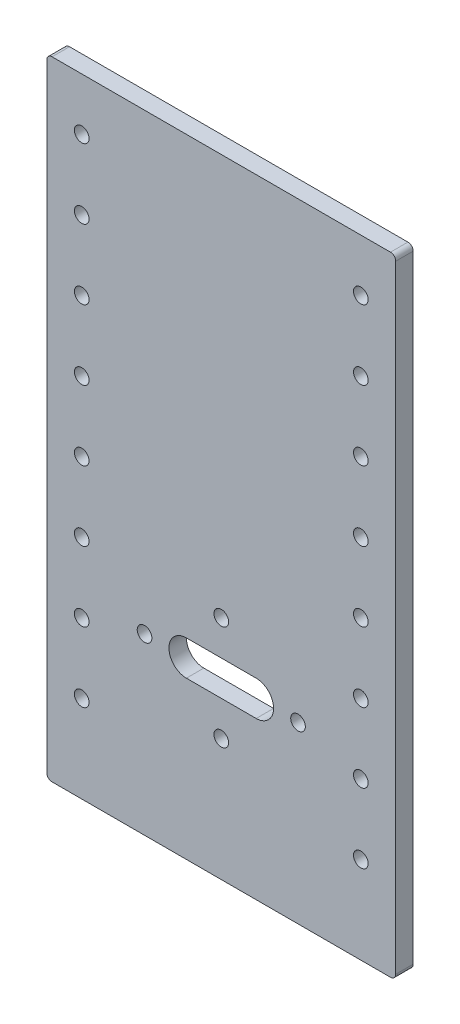
ISO-10303-21;
HEADER;
FILE_DESCRIPTION(('STEP AP214'),'2;1');
FILE_NAME('part.step','',(''),(''),'','','');
FILE_SCHEMA(('AUTOMOTIVE_DESIGN { 1 0 10303 214 1 1 1 1 }'));
ENDSEC;
DATA;
#1=APPLICATION_CONTEXT('core data for automotive mechanical design processes');
#2=APPLICATION_PROTOCOL_DEFINITION('international standard','automotive_design',2000,#1);
#3=PRODUCT_CONTEXT('',#1,'mechanical');
#4=PRODUCT('Part','Part','',(#3));
#5=PRODUCT_RELATED_PRODUCT_CATEGORY('part','',(#4));
#6=PRODUCT_DEFINITION_FORMATION('','',#4);
#7=PRODUCT_DEFINITION_CONTEXT('part definition',#1,'design');
#8=PRODUCT_DEFINITION('design','',#6,#7);
#9=PRODUCT_DEFINITION_SHAPE('','',#8);
#10=(LENGTH_UNIT() NAMED_UNIT(*) SI_UNIT(.MILLI.,.METRE.));
#11=(NAMED_UNIT(*) PLANE_ANGLE_UNIT() SI_UNIT($,.RADIAN.));
#12=(NAMED_UNIT(*) SI_UNIT($,.STERADIAN.) SOLID_ANGLE_UNIT());
#13=UNCERTAINTY_MEASURE_WITH_UNIT(LENGTH_MEASURE(1.E-05),#10,'distance_accuracy_value','');
#14=(GEOMETRIC_REPRESENTATION_CONTEXT(3) GLOBAL_UNCERTAINTY_ASSIGNED_CONTEXT((#13)) GLOBAL_UNIT_ASSIGNED_CONTEXT((#10,
#11,#12)) REPRESENTATION_CONTEXT('',''));
#15=CARTESIAN_POINT('',(0.,0.,0.));
#16=DIRECTION('',(0.,0.,1.));
#17=DIRECTION('',(1.,0.,0.));
#18=AXIS2_PLACEMENT_3D('',#15,#16,#17);
#19=CARTESIAN_POINT('',(50.,-90.,5.));
#20=DIRECTION('',(-1.,0.,0.));
#21=DIRECTION('',(0.,0.,1.));
#22=AXIS2_PLACEMENT_3D('',#19,#20,#21);
#23=PLANE('',#22);
#24=DIRECTION('',(0.,1.,0.));
#25=VECTOR('',#24,1.);
#26=CARTESIAN_POINT('',(50.,-90.,5.));
#27=LINE('',#26,#25);
#28=CARTESIAN_POINT('',(50.,-88.5,5.));
#29=VERTEX_POINT('',#28);
#30=CARTESIAN_POINT('',(50.,88.4999999999999,5.));
#31=VERTEX_POINT('',#30);
#32=EDGE_CURVE('E170',#29,#31,#27,.T.);
#33=ORIENTED_EDGE('',*,*,#32,.F.);
#34=DIRECTION('',(0.,0.,-1.));
#35=VECTOR('',#34,1.);
#36=CARTESIAN_POINT('',(50.,-88.5,5.));
#37=LINE('',#36,#35);
#38=CARTESIAN_POINT('',(50.,-88.5,0.));
#39=VERTEX_POINT('',#38);
#40=EDGE_CURVE('E192',#29,#39,#37,.T.);
#41=ORIENTED_EDGE('',*,*,#40,.T.);
#42=DIRECTION('',(0.,1.,0.));
#43=VECTOR('',#42,1.);
#44=CARTESIAN_POINT('',(50.,-90.,0.));
#45=LINE('',#44,#43);
#46=CARTESIAN_POINT('',(50.,88.4999999999999,0.));
#47=VERTEX_POINT('',#46);
#48=EDGE_CURVE('E166',#39,#47,#45,.T.);
#49=ORIENTED_EDGE('',*,*,#48,.T.);
#50=DIRECTION('',(0.,0.,-1.));
#51=VECTOR('',#50,1.);
#52=CARTESIAN_POINT('',(50.,88.5,5.));
#53=LINE('',#52,#51);
#54=EDGE_CURVE('E181',#47,#31,#53,.F.);
#55=ORIENTED_EDGE('',*,*,#54,.T.);
#56=EDGE_LOOP('',(#33,#41,#49,#55));
#57=FACE_BOUND('',#56,.T.);
#58=ADVANCED_FACE('F33',(#57),#23,.F.);
#59=CARTESIAN_POINT('',(-50.,90.,5.));
#60=DIRECTION('',(0.,-1.,0.));
#61=DIRECTION('',(0.,0.,-1.));
#62=AXIS2_PLACEMENT_3D('',#59,#60,#61);
#63=PLANE('',#62);
#64=DIRECTION('',(-1.,0.,0.));
#65=VECTOR('',#64,1.);
#66=CARTESIAN_POINT('',(-50.,90.,0.));
#67=LINE('',#66,#65);
#68=CARTESIAN_POINT('',(48.5,90.,0.));
#69=VERTEX_POINT('',#68);
#70=CARTESIAN_POINT('',(-48.5,90.,0.));
#71=VERTEX_POINT('',#70);
#72=EDGE_CURVE('E184',#69,#71,#67,.T.);
#73=ORIENTED_EDGE('',*,*,#72,.T.);
#74=DIRECTION('',(0.,0.,-1.));
#75=VECTOR('',#74,1.);
#76=CARTESIAN_POINT('',(-48.5,90.,5.));
#77=LINE('',#76,#75);
#78=CARTESIAN_POINT('',(-48.5,90.,5.));
#79=VERTEX_POINT('',#78);
#80=EDGE_CURVE('E11',#71,#79,#77,.F.);
#81=ORIENTED_EDGE('',*,*,#80,.T.);
#82=DIRECTION('',(-1.,0.,0.));
#83=VECTOR('',#82,1.);
#84=CARTESIAN_POINT('',(-50.,90.,5.));
#85=LINE('',#84,#83);
#86=CARTESIAN_POINT('',(48.5,90.,5.));
#87=VERTEX_POINT('',#86);
#88=EDGE_CURVE('E173',#87,#79,#85,.T.);
#89=ORIENTED_EDGE('',*,*,#88,.F.);
#90=DIRECTION('',(0.,0.,-1.));
#91=VECTOR('',#90,1.);
#92=CARTESIAN_POINT('',(48.5,90.,5.));
#93=LINE('',#92,#91);
#94=EDGE_CURVE('E41',#87,#69,#93,.T.);
#95=ORIENTED_EDGE('',*,*,#94,.T.);
#96=EDGE_LOOP('',(#73,#81,#89,#95));
#97=FACE_BOUND('',#96,.T.);
#98=ADVANCED_FACE('F223',(#97),#63,.F.);
#99=CARTESIAN_POINT('',(-50.,-90.,5.));
#100=DIRECTION('',(1.,0.,0.));
#101=DIRECTION('',(0.,0.,-1.));
#102=AXIS2_PLACEMENT_3D('',#99,#100,#101);
#103=PLANE('',#102);
#104=DIRECTION('',(0.,-1.,0.));
#105=VECTOR('',#104,1.);
#106=CARTESIAN_POINT('',(-50.,-90.,0.));
#107=LINE('',#106,#105);
#108=CARTESIAN_POINT('',(-50.,88.4999999999999,0.));
#109=VERTEX_POINT('',#108);
#110=CARTESIAN_POINT('',(-50.,-88.5,0.));
#111=VERTEX_POINT('',#110);
#112=EDGE_CURVE('E187',#109,#111,#107,.T.);
#113=ORIENTED_EDGE('',*,*,#112,.T.);
#114=DIRECTION('',(0.,0.,-1.));
#115=VECTOR('',#114,1.);
#116=CARTESIAN_POINT('',(-50.,-88.5,5.));
#117=LINE('',#116,#115);
#118=CARTESIAN_POINT('',(-50.,-88.5,5.));
#119=VERTEX_POINT('',#118);
#120=EDGE_CURVE('E48',#111,#119,#117,.F.);
#121=ORIENTED_EDGE('',*,*,#120,.T.);
#122=DIRECTION('',(0.,-1.,0.));
#123=VECTOR('',#122,1.);
#124=CARTESIAN_POINT('',(-50.,-90.,5.));
#125=LINE('',#124,#123);
#126=CARTESIAN_POINT('',(-50.,88.4999999999999,5.));
#127=VERTEX_POINT('',#126);
#128=EDGE_CURVE('E176',#127,#119,#125,.T.);
#129=ORIENTED_EDGE('',*,*,#128,.F.);
#130=DIRECTION('',(0.,0.,-1.));
#131=VECTOR('',#130,1.);
#132=CARTESIAN_POINT('',(-50.,88.5,5.));
#133=LINE('',#132,#131);
#134=EDGE_CURVE('E215',#127,#109,#133,.T.);
#135=ORIENTED_EDGE('',*,*,#134,.T.);
#136=EDGE_LOOP('',(#113,#121,#129,#135));
#137=FACE_BOUND('',#136,.T.);
#138=ADVANCED_FACE('F234',(#137),#103,.F.);
#139=CARTESIAN_POINT('',(-50.,-90.,5.));
#140=DIRECTION('',(0.,1.,0.));
#141=DIRECTION('',(0.,0.,1.));
#142=AXIS2_PLACEMENT_3D('',#139,#140,#141);
#143=PLANE('',#142);
#144=DIRECTION('',(1.,0.,0.));
#145=VECTOR('',#144,1.);
#146=CARTESIAN_POINT('',(-50.,-90.,0.));
#147=LINE('',#146,#145);
#148=CARTESIAN_POINT('',(-48.5,-90.,0.));
#149=VERTEX_POINT('',#148);
#150=CARTESIAN_POINT('',(48.5,-90.,0.));
#151=VERTEX_POINT('',#150);
#152=EDGE_CURVE('E174',#149,#151,#147,.T.);
#153=ORIENTED_EDGE('',*,*,#152,.T.);
#154=DIRECTION('',(0.,0.,-1.));
#155=VECTOR('',#154,1.);
#156=CARTESIAN_POINT('',(48.5,-90.,5.));
#157=LINE('',#156,#155);
#158=CARTESIAN_POINT('',(48.5,-90.,5.));
#159=VERTEX_POINT('',#158);
#160=EDGE_CURVE('E206',#151,#159,#157,.F.);
#161=ORIENTED_EDGE('',*,*,#160,.T.);
#162=DIRECTION('',(1.,0.,0.));
#163=VECTOR('',#162,1.);
#164=CARTESIAN_POINT('',(-50.,-90.,5.));
#165=LINE('',#164,#163);
#166=CARTESIAN_POINT('',(-48.5,-90.,5.));
#167=VERTEX_POINT('',#166);
#168=EDGE_CURVE('E178',#167,#159,#165,.T.);
#169=ORIENTED_EDGE('',*,*,#168,.F.);
#170=DIRECTION('',(0.,0.,-1.));
#171=VECTOR('',#170,1.);
#172=CARTESIAN_POINT('',(-48.5,-90.,5.));
#173=LINE('',#172,#171);
#174=EDGE_CURVE('E203',#167,#149,#173,.T.);
#175=ORIENTED_EDGE('',*,*,#174,.T.);
#176=EDGE_LOOP('',(#153,#161,#169,#175));
#177=FACE_BOUND('',#176,.T.);
#178=ADVANCED_FACE('F242',(#177),#143,.F.);
#179=CARTESIAN_POINT('',(0.,0.,5.));
#180=DIRECTION('',(0.,0.,-1.));
#181=DIRECTION('',(-1.,0.,0.));
#182=AXIS2_PLACEMENT_3D('',#179,#180,#181);
#183=PLANE('',#182);
#184=CARTESIAN_POINT('',(40.,55.,5.));
#185=DIRECTION('',(0.,0.,-1.));
#186=DIRECTION('',(-1.,0.,0.));
#187=AXIS2_PLACEMENT_3D('',#184,#185,#186);
#188=CIRCLE('',#187,2.1);
#189=CARTESIAN_POINT('',(37.9,55.,5.));
#190=VERTEX_POINT('',#189);
#191=EDGE_CURVE('E620',#190,#190,#188,.T.);
#192=ORIENTED_EDGE('',*,*,#191,.T.);
#193=EDGE_LOOP('',(#192));
#194=FACE_BOUND('',#193,.T.);
#195=CARTESIAN_POINT('',(40.,35.,5.));
#196=DIRECTION('',(0.,0.,-1.));
#197=DIRECTION('',(-1.,0.,0.));
#198=AXIS2_PLACEMENT_3D('',#195,#196,#197);
#199=CIRCLE('',#198,2.1);
#200=CARTESIAN_POINT('',(37.9,35.,5.));
#201=VERTEX_POINT('',#200);
#202=EDGE_CURVE('E662',#201,#201,#199,.T.);
#203=ORIENTED_EDGE('',*,*,#202,.T.);
#204=EDGE_LOOP('',(#203));
#205=FACE_BOUND('',#204,.T.);
#206=CARTESIAN_POINT('',(40.,15.,5.));
#207=DIRECTION('',(0.,0.,-1.));
#208=DIRECTION('',(-1.,0.,0.));
#209=AXIS2_PLACEMENT_3D('',#206,#207,#208);
#210=CIRCLE('',#209,2.1);
#211=CARTESIAN_POINT('',(37.9,15.,5.));
#212=VERTEX_POINT('',#211);
#213=EDGE_CURVE('E656',#212,#212,#210,.T.);
#214=ORIENTED_EDGE('',*,*,#213,.T.);
#215=EDGE_LOOP('',(#214));
#216=FACE_BOUND('',#215,.T.);
#217=CARTESIAN_POINT('',(40.,-4.99999999999999,5.));
#218=DIRECTION('',(0.,0.,-1.));
#219=DIRECTION('',(-1.,0.,0.));
#220=AXIS2_PLACEMENT_3D('',#217,#218,#219);
#221=CIRCLE('',#220,2.1);
#222=CARTESIAN_POINT('',(37.9,-4.99999999999999,5.));
#223=VERTEX_POINT('',#222);
#224=EDGE_CURVE('E650',#223,#223,#221,.T.);
#225=ORIENTED_EDGE('',*,*,#224,.T.);
#226=EDGE_LOOP('',(#225));
#227=FACE_BOUND('',#226,.T.);
#228=CARTESIAN_POINT('',(-40.,-4.99999999999998,5.));
#229=DIRECTION('',(0.,0.,-1.));
#230=DIRECTION('',(1.,0.,0.));
#231=AXIS2_PLACEMENT_3D('',#228,#229,#230);
#232=CIRCLE('',#231,2.1);
#233=CARTESIAN_POINT('',(-37.9,-4.99999999999998,5.));
#234=VERTEX_POINT('',#233);
#235=EDGE_CURVE('E644',#234,#234,#232,.T.);
#236=ORIENTED_EDGE('',*,*,#235,.T.);
#237=EDGE_LOOP('',(#236));
#238=FACE_BOUND('',#237,.T.);
#239=CARTESIAN_POINT('',(-40.,15.,5.));
#240=DIRECTION('',(0.,0.,-1.));
#241=DIRECTION('',(1.,0.,0.));
#242=AXIS2_PLACEMENT_3D('',#239,#240,#241);
#243=CIRCLE('',#242,2.1);
#244=CARTESIAN_POINT('',(-37.9,15.,5.));
#245=VERTEX_POINT('',#244);
#246=EDGE_CURVE('E638',#245,#245,#243,.T.);
#247=ORIENTED_EDGE('',*,*,#246,.T.);
#248=EDGE_LOOP('',(#247));
#249=FACE_BOUND('',#248,.T.);
#250=CARTESIAN_POINT('',(-40.,35.,5.));
#251=DIRECTION('',(0.,0.,-1.));
#252=DIRECTION('',(1.,0.,0.));
#253=AXIS2_PLACEMENT_3D('',#250,#251,#252);
#254=CIRCLE('',#253,2.1);
#255=CARTESIAN_POINT('',(-37.9,35.,5.));
#256=VERTEX_POINT('',#255);
#257=EDGE_CURVE('E632',#256,#256,#254,.T.);
#258=ORIENTED_EDGE('',*,*,#257,.T.);
#259=EDGE_LOOP('',(#258));
#260=FACE_BOUND('',#259,.T.);
#261=CARTESIAN_POINT('',(-40.,75.,5.));
#262=DIRECTION('',(0.,0.,-1.));
#263=DIRECTION('',(1.,0.,0.));
#264=AXIS2_PLACEMENT_3D('',#261,#262,#263);
#265=CIRCLE('',#264,2.1);
#266=CARTESIAN_POINT('',(-37.9,75.,5.));
#267=VERTEX_POINT('',#266);
#268=EDGE_CURVE('E625',#267,#267,#265,.T.);
#269=ORIENTED_EDGE('',*,*,#268,.T.);
#270=EDGE_LOOP('',(#269));
#271=FACE_BOUND('',#270,.T.);
#272=CARTESIAN_POINT('',(-40.,-25.,5.));
#273=DIRECTION('',(0.,0.,-1.));
#274=DIRECTION('',(1.,0.,0.));
#275=AXIS2_PLACEMENT_3D('',#272,#273,#274);
#276=CIRCLE('',#275,2.1);
#277=CARTESIAN_POINT('',(-37.9,-25.,5.));
#278=VERTEX_POINT('',#277);
#279=EDGE_CURVE('E697',#278,#278,#276,.T.);
#280=ORIENTED_EDGE('',*,*,#279,.T.);
#281=EDGE_LOOP('',(#280));
#282=FACE_BOUND('',#281,.T.);
#283=CARTESIAN_POINT('',(-40.,-45.,5.));
#284=DIRECTION('',(0.,0.,-1.));
#285=DIRECTION('',(1.,0.,0.));
#286=AXIS2_PLACEMENT_3D('',#283,#284,#285);
#287=CIRCLE('',#286,2.1);
#288=CARTESIAN_POINT('',(-37.9,-45.,5.));
#289=VERTEX_POINT('',#288);
#290=EDGE_CURVE('E703',#289,#289,#287,.T.);
#291=ORIENTED_EDGE('',*,*,#290,.T.);
#292=EDGE_LOOP('',(#291));
#293=FACE_BOUND('',#292,.T.);
#294=CARTESIAN_POINT('',(-40.,-65.,5.));
#295=DIRECTION('',(0.,0.,-1.));
#296=DIRECTION('',(1.,0.,0.));
#297=AXIS2_PLACEMENT_3D('',#294,#295,#296);
#298=CIRCLE('',#297,2.1);
#299=CARTESIAN_POINT('',(-37.9,-65.,5.));
#300=VERTEX_POINT('',#299);
#301=EDGE_CURVE('E674',#300,#300,#298,.T.);
#302=ORIENTED_EDGE('',*,*,#301,.T.);
#303=EDGE_LOOP('',(#302));
#304=FACE_BOUND('',#303,.T.);
#305=CARTESIAN_POINT('',(40.,-65.,5.));
#306=DIRECTION('',(0.,0.,-1.));
#307=DIRECTION('',(-1.,0.,0.));
#308=AXIS2_PLACEMENT_3D('',#305,#306,#307);
#309=CIRCLE('',#308,2.1);
#310=CARTESIAN_POINT('',(37.9,-65.,5.));
#311=VERTEX_POINT('',#310);
#312=EDGE_CURVE('E673',#311,#311,#309,.T.);
#313=ORIENTED_EDGE('',*,*,#312,.T.);
#314=EDGE_LOOP('',(#313));
#315=FACE_BOUND('',#314,.T.);
#316=CARTESIAN_POINT('',(40.,-45.,5.));
#317=DIRECTION('',(0.,0.,-1.));
#318=DIRECTION('',(-1.,0.,0.));
#319=AXIS2_PLACEMENT_3D('',#316,#317,#318);
#320=CIRCLE('',#319,2.1);
#321=CARTESIAN_POINT('',(37.9,-45.,5.));
#322=VERTEX_POINT('',#321);
#323=EDGE_CURVE('E680',#322,#322,#320,.T.);
#324=ORIENTED_EDGE('',*,*,#323,.T.);
#325=EDGE_LOOP('',(#324));
#326=FACE_BOUND('',#325,.T.);
#327=CARTESIAN_POINT('',(40.,-25.,5.));
#328=DIRECTION('',(0.,0.,-1.));
#329=DIRECTION('',(-1.,0.,0.));
#330=AXIS2_PLACEMENT_3D('',#327,#328,#329);
#331=CIRCLE('',#330,2.1);
#332=CARTESIAN_POINT('',(37.9,-25.,5.));
#333=VERTEX_POINT('',#332);
#334=EDGE_CURVE('E686',#333,#333,#331,.T.);
#335=ORIENTED_EDGE('',*,*,#334,.T.);
#336=EDGE_LOOP('',(#335));
#337=FACE_BOUND('',#336,.T.);
#338=CARTESIAN_POINT('',(-40.,55.,5.));
#339=DIRECTION('',(0.,0.,-1.));
#340=DIRECTION('',(1.,0.,0.));
#341=AXIS2_PLACEMENT_3D('',#338,#339,#340);
#342=CIRCLE('',#341,2.1);
#343=CARTESIAN_POINT('',(-37.9,55.,5.));
#344=VERTEX_POINT('',#343);
#345=EDGE_CURVE('E626',#344,#344,#342,.T.);
#346=ORIENTED_EDGE('',*,*,#345,.T.);
#347=EDGE_LOOP('',(#346));
#348=FACE_BOUND('',#347,.T.);
#349=CARTESIAN_POINT('',(40.,75.,5.));
#350=DIRECTION('',(0.,0.,-1.));
#351=DIRECTION('',(-1.,0.,0.));
#352=AXIS2_PLACEMENT_3D('',#349,#350,#351);
#353=CIRCLE('',#352,2.1);
#354=CARTESIAN_POINT('',(37.9,75.,5.));
#355=VERTEX_POINT('',#354);
#356=EDGE_CURVE('E598',#355,#355,#353,.T.);
#357=ORIENTED_EDGE('',*,*,#356,.T.);
#358=EDGE_LOOP('',(#357));
#359=FACE_BOUND('',#358,.T.);
#360=CARTESIAN_POINT('',(22.,-40.,5.));
#361=DIRECTION('',(0.,0.,-1.));
#362=DIRECTION('',(-1.,0.,0.));
#363=AXIS2_PLACEMENT_3D('',#360,#361,#362);
#364=CIRCLE('',#363,2.1);
#365=CARTESIAN_POINT('',(19.9,-40.,5.));
#366=VERTEX_POINT('',#365);
#367=EDGE_CURVE('E160',#366,#366,#364,.T.);
#368=ORIENTED_EDGE('',*,*,#367,.T.);
#369=EDGE_LOOP('',(#368));
#370=FACE_BOUND('',#369,.T.);
#371=CARTESIAN_POINT('',(0.,-25.,5.));
#372=DIRECTION('',(0.,0.,-1.));
#373=DIRECTION('',(-1.,0.,0.));
#374=AXIS2_PLACEMENT_3D('',#371,#372,#373);
#375=CIRCLE('',#374,2.1);
#376=CARTESIAN_POINT('',(-2.1,-25.,5.));
#377=VERTEX_POINT('',#376);
#378=EDGE_CURVE('E575',#377,#377,#375,.T.);
#379=ORIENTED_EDGE('',*,*,#378,.T.);
#380=EDGE_LOOP('',(#379));
#381=FACE_BOUND('',#380,.T.);
#382=CARTESIAN_POINT('',(-22.,-40.,5.));
#383=DIRECTION('',(0.,0.,-1.));
#384=DIRECTION('',(1.,0.,0.));
#385=AXIS2_PLACEMENT_3D('',#382,#383,#384);
#386=CIRCLE('',#385,2.1);
#387=CARTESIAN_POINT('',(-19.9,-40.,5.));
#388=VERTEX_POINT('',#387);
#389=EDGE_CURVE('E579',#388,#388,#386,.T.);
#390=ORIENTED_EDGE('',*,*,#389,.T.);
#391=EDGE_LOOP('',(#390));
#392=FACE_BOUND('',#391,.T.);
#393=CARTESIAN_POINT('',(0.,-55.,5.));
#394=DIRECTION('',(0.,0.,-1.));
#395=DIRECTION('',(1.,0.,0.));
#396=AXIS2_PLACEMENT_3D('',#393,#394,#395);
#397=CIRCLE('',#396,2.1);
#398=CARTESIAN_POINT('',(2.1,-55.,5.));
#399=VERTEX_POINT('',#398);
#400=EDGE_CURVE('E587',#399,#399,#397,.T.);
#401=ORIENTED_EDGE('',*,*,#400,.T.);
#402=EDGE_LOOP('',(#401));
#403=FACE_BOUND('',#402,.T.);
#404=DIRECTION('',(1.,0.,0.));
#405=VECTOR('',#404,1.);
#406=CARTESIAN_POINT('',(10.,-35.,5.));
#407=LINE('',#406,#405);
#408=CARTESIAN_POINT('',(-9.99999999999999,-35.,5.));
#409=VERTEX_POINT('',#408);
#410=CARTESIAN_POINT('',(10.,-35.,5.));
#411=VERTEX_POINT('',#410);
#412=EDGE_CURVE('E135',#409,#411,#407,.T.);
#413=ORIENTED_EDGE('',*,*,#412,.T.);
#414=CARTESIAN_POINT('',(10.,-40.,5.));
#415=DIRECTION('',(0.,0.,-1.));
#416=DIRECTION('',(-1.,0.,0.));
#417=AXIS2_PLACEMENT_3D('',#414,#415,#416);
#418=CIRCLE('',#417,5.00000000000002);
#419=CARTESIAN_POINT('',(10.,-45.,5.));
#420=VERTEX_POINT('',#419);
#421=EDGE_CURVE('E127',#411,#420,#418,.T.);
#422=ORIENTED_EDGE('',*,*,#421,.T.);
#423=DIRECTION('',(-1.,0.,0.));
#424=VECTOR('',#423,1.);
#425=CARTESIAN_POINT('',(10.,-45.,5.));
#426=LINE('',#425,#424);
#427=CARTESIAN_POINT('',(-9.99999999999999,-45.,5.));
#428=VERTEX_POINT('',#427);
#429=EDGE_CURVE('E139',#420,#428,#426,.T.);
#430=ORIENTED_EDGE('',*,*,#429,.T.);
#431=CARTESIAN_POINT('',(-9.99999999999999,-40.,5.));
#432=DIRECTION('',(0.,0.,-1.));
#433=DIRECTION('',(-1.,0.,0.));
#434=AXIS2_PLACEMENT_3D('',#431,#432,#433);
#435=CIRCLE('',#434,5.00000000000002);
#436=EDGE_CURVE('E143',#428,#409,#435,.T.);
#437=ORIENTED_EDGE('',*,*,#436,.T.);
#438=EDGE_LOOP('',(#413,#422,#430,#437));
#439=FACE_BOUND('',#438,.T.);
#440=ORIENTED_EDGE('',*,*,#168,.T.);
#441=CARTESIAN_POINT('',(48.5,-88.5,5.));
#442=DIRECTION('',(0.,0.,-1.));
#443=DIRECTION('',(-1.,0.,0.));
#444=AXIS2_PLACEMENT_3D('',#441,#442,#443);
#445=CIRCLE('',#444,1.5);
#446=EDGE_CURVE('E213',#159,#29,#445,.F.);
#447=ORIENTED_EDGE('',*,*,#446,.T.);
#448=ORIENTED_EDGE('',*,*,#32,.T.);
#449=CARTESIAN_POINT('',(48.5,88.5,5.));
#450=DIRECTION('',(0.,0.,-1.));
#451=DIRECTION('',(-1.,0.,0.));
#452=AXIS2_PLACEMENT_3D('',#449,#450,#451);
#453=CIRCLE('',#452,1.5);
#454=EDGE_CURVE('E208',#31,#87,#453,.F.);
#455=ORIENTED_EDGE('',*,*,#454,.T.);
#456=ORIENTED_EDGE('',*,*,#88,.T.);
#457=CARTESIAN_POINT('',(-48.5,88.5,5.));
#458=DIRECTION('',(0.,0.,-1.));
#459=DIRECTION('',(-1.,0.,0.));
#460=AXIS2_PLACEMENT_3D('',#457,#458,#459);
#461=CIRCLE('',#460,1.5);
#462=EDGE_CURVE('E55',#79,#127,#461,.F.);
#463=ORIENTED_EDGE('',*,*,#462,.T.);
#464=ORIENTED_EDGE('',*,*,#128,.T.);
#465=CARTESIAN_POINT('',(-48.5,-88.5,5.));
#466=DIRECTION('',(0.,0.,-1.));
#467=DIRECTION('',(-1.,0.,0.));
#468=AXIS2_PLACEMENT_3D('',#465,#466,#467);
#469=CIRCLE('',#468,1.5);
#470=EDGE_CURVE('E211',#119,#167,#469,.F.);
#471=ORIENTED_EDGE('',*,*,#470,.T.);
#472=EDGE_LOOP('',(#440,#447,#448,#455,#456,#463,#464,#471));
#473=FACE_BOUND('',#472,.T.);
#474=ADVANCED_FACE('F145',(#194,#205,#216,#227,#238,#249,#260,#271,#282,#293,#304,#315,#326,
#337,#348,#359,#370,#381,#392,#403,#439,#473),#183,.F.);
#475=CARTESIAN_POINT('',(0.,0.,0.));
#476=DIRECTION('',(0.,0.,-1.));
#477=DIRECTION('',(-1.,0.,0.));
#478=AXIS2_PLACEMENT_3D('',#475,#476,#477);
#479=PLANE('',#478);
#480=CARTESIAN_POINT('',(40.,55.,0.));
#481=DIRECTION('',(0.,0.,-1.));
#482=DIRECTION('',(-1.,0.,0.));
#483=AXIS2_PLACEMENT_3D('',#480,#481,#482);
#484=CIRCLE('',#483,2.1);
#485=CARTESIAN_POINT('',(37.9,55.,0.));
#486=VERTEX_POINT('',#485);
#487=EDGE_CURVE('E665',#486,#486,#484,.T.);
#488=ORIENTED_EDGE('',*,*,#487,.F.);
#489=EDGE_LOOP('',(#488));
#490=FACE_BOUND('',#489,.T.);
#491=CARTESIAN_POINT('',(40.,35.,0.));
#492=DIRECTION('',(0.,0.,-1.));
#493=DIRECTION('',(-1.,0.,0.));
#494=AXIS2_PLACEMENT_3D('',#491,#492,#493);
#495=CIRCLE('',#494,2.1);
#496=CARTESIAN_POINT('',(37.9,35.,0.));
#497=VERTEX_POINT('',#496);
#498=EDGE_CURVE('E659',#497,#497,#495,.T.);
#499=ORIENTED_EDGE('',*,*,#498,.F.);
#500=EDGE_LOOP('',(#499));
#501=FACE_BOUND('',#500,.T.);
#502=CARTESIAN_POINT('',(40.,15.,0.));
#503=DIRECTION('',(0.,0.,-1.));
#504=DIRECTION('',(-1.,0.,0.));
#505=AXIS2_PLACEMENT_3D('',#502,#503,#504);
#506=CIRCLE('',#505,2.1);
#507=CARTESIAN_POINT('',(37.9,15.,0.));
#508=VERTEX_POINT('',#507);
#509=EDGE_CURVE('E653',#508,#508,#506,.T.);
#510=ORIENTED_EDGE('',*,*,#509,.F.);
#511=EDGE_LOOP('',(#510));
#512=FACE_BOUND('',#511,.T.);
#513=CARTESIAN_POINT('',(40.,-4.99999999999999,0.));
#514=DIRECTION('',(0.,0.,-1.));
#515=DIRECTION('',(-1.,0.,0.));
#516=AXIS2_PLACEMENT_3D('',#513,#514,#515);
#517=CIRCLE('',#516,2.1);
#518=CARTESIAN_POINT('',(37.9,-4.99999999999999,0.));
#519=VERTEX_POINT('',#518);
#520=EDGE_CURVE('E647',#519,#519,#517,.T.);
#521=ORIENTED_EDGE('',*,*,#520,.F.);
#522=EDGE_LOOP('',(#521));
#523=FACE_BOUND('',#522,.T.);
#524=CARTESIAN_POINT('',(-40.,-4.99999999999998,0.));
#525=DIRECTION('',(0.,0.,-1.));
#526=DIRECTION('',(1.,0.,0.));
#527=AXIS2_PLACEMENT_3D('',#524,#525,#526);
#528=CIRCLE('',#527,2.1);
#529=CARTESIAN_POINT('',(-37.9,-4.99999999999998,0.));
#530=VERTEX_POINT('',#529);
#531=EDGE_CURVE('E641',#530,#530,#528,.T.);
#532=ORIENTED_EDGE('',*,*,#531,.F.);
#533=EDGE_LOOP('',(#532));
#534=FACE_BOUND('',#533,.T.);
#535=CARTESIAN_POINT('',(-40.,15.,0.));
#536=DIRECTION('',(0.,0.,-1.));
#537=DIRECTION('',(1.,0.,0.));
#538=AXIS2_PLACEMENT_3D('',#535,#536,#537);
#539=CIRCLE('',#538,2.1);
#540=CARTESIAN_POINT('',(-37.9,15.,0.));
#541=VERTEX_POINT('',#540);
#542=EDGE_CURVE('E635',#541,#541,#539,.T.);
#543=ORIENTED_EDGE('',*,*,#542,.F.);
#544=EDGE_LOOP('',(#543));
#545=FACE_BOUND('',#544,.T.);
#546=CARTESIAN_POINT('',(-40.,35.,0.));
#547=DIRECTION('',(0.,0.,-1.));
#548=DIRECTION('',(1.,0.,0.));
#549=AXIS2_PLACEMENT_3D('',#546,#547,#548);
#550=CIRCLE('',#549,2.1);
#551=CARTESIAN_POINT('',(-37.9,35.,0.));
#552=VERTEX_POINT('',#551);
#553=EDGE_CURVE('E629',#552,#552,#550,.T.);
#554=ORIENTED_EDGE('',*,*,#553,.F.);
#555=EDGE_LOOP('',(#554));
#556=FACE_BOUND('',#555,.T.);
#557=CARTESIAN_POINT('',(-40.,75.,0.));
#558=DIRECTION('',(0.,0.,-1.));
#559=DIRECTION('',(1.,0.,0.));
#560=AXIS2_PLACEMENT_3D('',#557,#558,#559);
#561=CIRCLE('',#560,2.1);
#562=CARTESIAN_POINT('',(-37.9,75.,0.));
#563=VERTEX_POINT('',#562);
#564=EDGE_CURVE('E622',#563,#563,#561,.T.);
#565=ORIENTED_EDGE('',*,*,#564,.F.);
#566=EDGE_LOOP('',(#565));
#567=FACE_BOUND('',#566,.T.);
#568=CARTESIAN_POINT('',(-40.,-25.,0.));
#569=DIRECTION('',(0.,0.,-1.));
#570=DIRECTION('',(1.,0.,0.));
#571=AXIS2_PLACEMENT_3D('',#568,#569,#570);
#572=CIRCLE('',#571,2.1);
#573=CARTESIAN_POINT('',(-37.9,-25.,0.));
#574=VERTEX_POINT('',#573);
#575=EDGE_CURVE('E694',#574,#574,#572,.T.);
#576=ORIENTED_EDGE('',*,*,#575,.F.);
#577=EDGE_LOOP('',(#576));
#578=FACE_BOUND('',#577,.T.);
#579=CARTESIAN_POINT('',(-40.,-45.,0.));
#580=DIRECTION('',(0.,0.,-1.));
#581=DIRECTION('',(1.,0.,0.));
#582=AXIS2_PLACEMENT_3D('',#579,#580,#581);
#583=CIRCLE('',#582,2.1);
#584=CARTESIAN_POINT('',(-37.9,-45.,0.));
#585=VERTEX_POINT('',#584);
#586=EDGE_CURVE('E700',#585,#585,#583,.T.);
#587=ORIENTED_EDGE('',*,*,#586,.F.);
#588=EDGE_LOOP('',(#587));
#589=FACE_BOUND('',#588,.T.);
#590=CARTESIAN_POINT('',(-40.,-65.,0.));
#591=DIRECTION('',(0.,0.,-1.));
#592=DIRECTION('',(1.,0.,0.));
#593=AXIS2_PLACEMENT_3D('',#590,#591,#592);
#594=CIRCLE('',#593,2.1);
#595=CARTESIAN_POINT('',(-37.9,-65.,0.));
#596=VERTEX_POINT('',#595);
#597=EDGE_CURVE('E706',#596,#596,#594,.T.);
#598=ORIENTED_EDGE('',*,*,#597,.F.);
#599=EDGE_LOOP('',(#598));
#600=FACE_BOUND('',#599,.T.);
#601=CARTESIAN_POINT('',(40.,-65.,0.));
#602=DIRECTION('',(0.,0.,-1.));
#603=DIRECTION('',(-1.,0.,0.));
#604=AXIS2_PLACEMENT_3D('',#601,#602,#603);
#605=CIRCLE('',#604,2.1);
#606=CARTESIAN_POINT('',(37.9,-65.,0.));
#607=VERTEX_POINT('',#606);
#608=EDGE_CURVE('E670',#607,#607,#605,.T.);
#609=ORIENTED_EDGE('',*,*,#608,.F.);
#610=EDGE_LOOP('',(#609));
#611=FACE_BOUND('',#610,.T.);
#612=CARTESIAN_POINT('',(40.,-45.,0.));
#613=DIRECTION('',(0.,0.,-1.));
#614=DIRECTION('',(-1.,0.,0.));
#615=AXIS2_PLACEMENT_3D('',#612,#613,#614);
#616=CIRCLE('',#615,2.1);
#617=CARTESIAN_POINT('',(37.9,-45.,0.));
#618=VERTEX_POINT('',#617);
#619=EDGE_CURVE('E677',#618,#618,#616,.T.);
#620=ORIENTED_EDGE('',*,*,#619,.F.);
#621=EDGE_LOOP('',(#620));
#622=FACE_BOUND('',#621,.T.);
#623=CARTESIAN_POINT('',(40.,-25.,0.));
#624=DIRECTION('',(0.,0.,-1.));
#625=DIRECTION('',(-1.,0.,0.));
#626=AXIS2_PLACEMENT_3D('',#623,#624,#625);
#627=CIRCLE('',#626,2.1);
#628=CARTESIAN_POINT('',(37.9,-25.,0.));
#629=VERTEX_POINT('',#628);
#630=EDGE_CURVE('E683',#629,#629,#627,.T.);
#631=ORIENTED_EDGE('',*,*,#630,.F.);
#632=EDGE_LOOP('',(#631));
#633=FACE_BOUND('',#632,.T.);
#634=CARTESIAN_POINT('',(-40.,55.,0.));
#635=DIRECTION('',(0.,0.,-1.));
#636=DIRECTION('',(1.,0.,0.));
#637=AXIS2_PLACEMENT_3D('',#634,#635,#636);
#638=CIRCLE('',#637,2.1);
#639=CARTESIAN_POINT('',(-37.9,55.,0.));
#640=VERTEX_POINT('',#639);
#641=EDGE_CURVE('E689',#640,#640,#638,.T.);
#642=ORIENTED_EDGE('',*,*,#641,.F.);
#643=EDGE_LOOP('',(#642));
#644=FACE_BOUND('',#643,.T.);
#645=CARTESIAN_POINT('',(40.,75.,0.));
#646=DIRECTION('',(0.,0.,-1.));
#647=DIRECTION('',(-1.,0.,0.));
#648=AXIS2_PLACEMENT_3D('',#645,#646,#647);
#649=CIRCLE('',#648,2.1);
#650=CARTESIAN_POINT('',(37.9,75.,0.));
#651=VERTEX_POINT('',#650);
#652=EDGE_CURVE('E590',#651,#651,#649,.T.);
#653=ORIENTED_EDGE('',*,*,#652,.F.);
#654=EDGE_LOOP('',(#653));
#655=FACE_BOUND('',#654,.T.);
#656=CARTESIAN_POINT('',(22.,-40.,0.));
#657=DIRECTION('',(0.,0.,-1.));
#658=DIRECTION('',(-1.,0.,0.));
#659=AXIS2_PLACEMENT_3D('',#656,#657,#658);
#660=CIRCLE('',#659,2.1);
#661=CARTESIAN_POINT('',(19.9,-40.,0.));
#662=VERTEX_POINT('',#661);
#663=EDGE_CURVE('E580',#662,#662,#660,.T.);
#664=ORIENTED_EDGE('',*,*,#663,.F.);
#665=EDGE_LOOP('',(#664));
#666=FACE_BOUND('',#665,.T.);
#667=CARTESIAN_POINT('',(0.,-25.,0.));
#668=DIRECTION('',(0.,0.,-1.));
#669=DIRECTION('',(-1.,0.,0.));
#670=AXIS2_PLACEMENT_3D('',#667,#668,#669);
#671=CIRCLE('',#670,2.1);
#672=CARTESIAN_POINT('',(-2.1,-25.,0.));
#673=VERTEX_POINT('',#672);
#674=EDGE_CURVE('E153',#673,#673,#671,.T.);
#675=ORIENTED_EDGE('',*,*,#674,.F.);
#676=EDGE_LOOP('',(#675));
#677=FACE_BOUND('',#676,.T.);
#678=CARTESIAN_POINT('',(-22.,-40.,0.));
#679=DIRECTION('',(0.,0.,-1.));
#680=DIRECTION('',(1.,0.,0.));
#681=AXIS2_PLACEMENT_3D('',#678,#679,#680);
#682=CIRCLE('',#681,2.1);
#683=CARTESIAN_POINT('',(-19.9,-40.,0.));
#684=VERTEX_POINT('',#683);
#685=EDGE_CURVE('E582',#684,#684,#682,.T.);
#686=ORIENTED_EDGE('',*,*,#685,.F.);
#687=EDGE_LOOP('',(#686));
#688=FACE_BOUND('',#687,.T.);
#689=CARTESIAN_POINT('',(0.,-55.,0.));
#690=DIRECTION('',(0.,0.,-1.));
#691=DIRECTION('',(1.,0.,0.));
#692=AXIS2_PLACEMENT_3D('',#689,#690,#691);
#693=CIRCLE('',#692,2.1);
#694=CARTESIAN_POINT('',(2.1,-55.,0.));
#695=VERTEX_POINT('',#694);
#696=EDGE_CURVE('E595',#695,#695,#693,.T.);
#697=ORIENTED_EDGE('',*,*,#696,.F.);
#698=EDGE_LOOP('',(#697));
#699=FACE_BOUND('',#698,.T.);
#700=CARTESIAN_POINT('',(10.,-40.,0.));
#701=DIRECTION('',(0.,0.,-1.));
#702=DIRECTION('',(-1.,0.,0.));
#703=AXIS2_PLACEMENT_3D('',#700,#701,#702);
#704=CIRCLE('',#703,5.00000000000002);
#705=CARTESIAN_POINT('',(10.,-35.,0.));
#706=VERTEX_POINT('',#705);
#707=CARTESIAN_POINT('',(10.,-45.,0.));
#708=VERTEX_POINT('',#707);
#709=EDGE_CURVE('E130',#706,#708,#704,.T.);
#710=ORIENTED_EDGE('',*,*,#709,.F.);
#711=DIRECTION('',(1.,0.,0.));
#712=VECTOR('',#711,1.);
#713=CARTESIAN_POINT('',(10.,-35.,0.));
#714=LINE('',#713,#712);
#715=CARTESIAN_POINT('',(-9.99999999999999,-35.,0.));
#716=VERTEX_POINT('',#715);
#717=EDGE_CURVE('E147',#716,#706,#714,.T.);
#718=ORIENTED_EDGE('',*,*,#717,.F.);
#719=CARTESIAN_POINT('',(-9.99999999999999,-40.,0.));
#720=DIRECTION('',(0.,0.,-1.));
#721=DIRECTION('',(-1.,0.,0.));
#722=AXIS2_PLACEMENT_3D('',#719,#720,#721);
#723=CIRCLE('',#722,5.00000000000002);
#724=CARTESIAN_POINT('',(-9.99999999999999,-45.,0.));
#725=VERTEX_POINT('',#724);
#726=EDGE_CURVE('E150',#725,#716,#723,.T.);
#727=ORIENTED_EDGE('',*,*,#726,.F.);
#728=DIRECTION('',(-1.,0.,0.));
#729=VECTOR('',#728,1.);
#730=CARTESIAN_POINT('',(10.,-45.,0.));
#731=LINE('',#730,#729);
#732=EDGE_CURVE('E159',#708,#725,#731,.T.);
#733=ORIENTED_EDGE('',*,*,#732,.F.);
#734=EDGE_LOOP('',(#710,#718,#727,#733));
#735=FACE_BOUND('',#734,.T.);
#736=ORIENTED_EDGE('',*,*,#48,.F.);
#737=CARTESIAN_POINT('',(48.5,-88.5,0.));
#738=DIRECTION('',(0.,0.,-1.));
#739=DIRECTION('',(-1.,0.,0.));
#740=AXIS2_PLACEMENT_3D('',#737,#738,#739);
#741=CIRCLE('',#740,1.5);
#742=EDGE_CURVE('E201',#39,#151,#741,.T.);
#743=ORIENTED_EDGE('',*,*,#742,.T.);
#744=ORIENTED_EDGE('',*,*,#152,.F.);
#745=CARTESIAN_POINT('',(-48.5,-88.5,0.));
#746=DIRECTION('',(0.,0.,-1.));
#747=DIRECTION('',(-1.,0.,0.));
#748=AXIS2_PLACEMENT_3D('',#745,#746,#747);
#749=CIRCLE('',#748,1.5);
#750=EDGE_CURVE('E199',#149,#111,#749,.T.);
#751=ORIENTED_EDGE('',*,*,#750,.T.);
#752=ORIENTED_EDGE('',*,*,#112,.F.);
#753=CARTESIAN_POINT('',(-48.5,88.5,0.));
#754=DIRECTION('',(0.,0.,-1.));
#755=DIRECTION('',(-1.,0.,0.));
#756=AXIS2_PLACEMENT_3D('',#753,#754,#755);
#757=CIRCLE('',#756,1.5);
#758=EDGE_CURVE('E197',#109,#71,#757,.T.);
#759=ORIENTED_EDGE('',*,*,#758,.T.);
#760=ORIENTED_EDGE('',*,*,#72,.F.);
#761=CARTESIAN_POINT('',(48.5,88.5,0.));
#762=DIRECTION('',(0.,0.,-1.));
#763=DIRECTION('',(-1.,0.,0.));
#764=AXIS2_PLACEMENT_3D('',#761,#762,#763);
#765=CIRCLE('',#764,1.5);
#766=EDGE_CURVE('E195',#69,#47,#765,.T.);
#767=ORIENTED_EDGE('',*,*,#766,.T.);
#768=EDGE_LOOP('',(#736,#743,#744,#751,#752,#759,#760,#767));
#769=FACE_BOUND('',#768,.T.);
#770=ADVANCED_FACE('F229',(#490,#501,#512,#523,#534,#545,#556,#567,#578,#589,#600,#611,#622,
#633,#644,#655,#666,#677,#688,#699,#735,#769),#479,.T.);
#771=CARTESIAN_POINT('',(10.,-40.,5.));
#772=DIRECTION('',(0.,0.,-1.));
#773=DIRECTION('',(-1.,0.,0.));
#774=AXIS2_PLACEMENT_3D('',#771,#772,#773);
#775=CYLINDRICAL_SURFACE('',#774,5.00000000000002);
#776=ORIENTED_EDGE('',*,*,#709,.T.);
#777=DIRECTION('',(0.,0.,-1.));
#778=VECTOR('',#777,1.);
#779=CARTESIAN_POINT('',(10.,-45.,5.));
#780=LINE('',#779,#778);
#781=EDGE_CURVE('E123',#420,#708,#780,.T.);
#782=ORIENTED_EDGE('',*,*,#781,.F.);
#783=ORIENTED_EDGE('',*,*,#421,.F.);
#784=DIRECTION('',(0.,0.,-1.));
#785=VECTOR('',#784,1.);
#786=CARTESIAN_POINT('',(10.,-35.,5.));
#787=LINE('',#786,#785);
#788=EDGE_CURVE('E164',#411,#706,#787,.T.);
#789=ORIENTED_EDGE('',*,*,#788,.T.);
#790=EDGE_LOOP('',(#776,#782,#783,#789));
#791=FACE_BOUND('',#790,.T.);
#792=ADVANCED_FACE('F125',(#791),#775,.F.);
#793=CARTESIAN_POINT('',(10.,-35.,5.));
#794=DIRECTION('',(0.,1.,0.));
#795=DIRECTION('',(-1.,0.,0.));
#796=AXIS2_PLACEMENT_3D('',#793,#794,#795);
#797=PLANE('',#796);
#798=ORIENTED_EDGE('',*,*,#717,.T.);
#799=ORIENTED_EDGE('',*,*,#788,.F.);
#800=ORIENTED_EDGE('',*,*,#412,.F.);
#801=DIRECTION('',(0.,0.,-1.));
#802=VECTOR('',#801,1.);
#803=CARTESIAN_POINT('',(-9.99999999999999,-35.,5.));
#804=LINE('',#803,#802);
#805=EDGE_CURVE('E167',#409,#716,#804,.T.);
#806=ORIENTED_EDGE('',*,*,#805,.T.);
#807=EDGE_LOOP('',(#798,#799,#800,#806));
#808=FACE_BOUND('',#807,.T.);
#809=ADVANCED_FACE('F478',(#808),#797,.F.);
#810=CARTESIAN_POINT('',(-9.99999999999999,-40.,5.));
#811=DIRECTION('',(0.,0.,-1.));
#812=DIRECTION('',(-1.,0.,0.));
#813=AXIS2_PLACEMENT_3D('',#810,#811,#812);
#814=CYLINDRICAL_SURFACE('',#813,5.00000000000002);
#815=ORIENTED_EDGE('',*,*,#726,.T.);
#816=ORIENTED_EDGE('',*,*,#805,.F.);
#817=ORIENTED_EDGE('',*,*,#436,.F.);
#818=DIRECTION('',(0.,0.,-1.));
#819=VECTOR('',#818,1.);
#820=CARTESIAN_POINT('',(-9.99999999999999,-45.,5.));
#821=LINE('',#820,#819);
#822=EDGE_CURVE('E134',#428,#725,#821,.T.);
#823=ORIENTED_EDGE('',*,*,#822,.T.);
#824=EDGE_LOOP('',(#815,#816,#817,#823));
#825=FACE_BOUND('',#824,.T.);
#826=ADVANCED_FACE('F481',(#825),#814,.F.);
#827=CARTESIAN_POINT('',(10.,-45.,5.));
#828=DIRECTION('',(0.,-1.,0.));
#829=DIRECTION('',(1.,0.,0.));
#830=AXIS2_PLACEMENT_3D('',#827,#828,#829);
#831=PLANE('',#830);
#832=ORIENTED_EDGE('',*,*,#732,.T.);
#833=ORIENTED_EDGE('',*,*,#822,.F.);
#834=ORIENTED_EDGE('',*,*,#429,.F.);
#835=ORIENTED_EDGE('',*,*,#781,.T.);
#836=EDGE_LOOP('',(#832,#833,#834,#835));
#837=FACE_BOUND('',#836,.T.);
#838=ADVANCED_FACE('F140',(#837),#831,.F.);
#839=CARTESIAN_POINT('',(0.,-55.,5.));
#840=DIRECTION('',(0.,0.,-1.));
#841=DIRECTION('',(-1.,0.,0.));
#842=AXIS2_PLACEMENT_3D('',#839,#840,#841);
#843=CYLINDRICAL_SURFACE('',#842,2.1);
#844=ORIENTED_EDGE('',*,*,#400,.F.);
#845=EDGE_LOOP('',(#844));
#846=FACE_BOUND('',#845,.T.);
#847=ORIENTED_EDGE('',*,*,#696,.T.);
#848=EDGE_LOOP('',(#847));
#849=FACE_BOUND('',#848,.T.);
#850=ADVANCED_FACE('F468',(#846,#849),#843,.F.);
#851=CARTESIAN_POINT('',(-22.,-40.,5.));
#852=DIRECTION('',(0.,0.,-1.));
#853=DIRECTION('',(-1.,0.,0.));
#854=AXIS2_PLACEMENT_3D('',#851,#852,#853);
#855=CYLINDRICAL_SURFACE('',#854,2.1);
#856=ORIENTED_EDGE('',*,*,#389,.F.);
#857=EDGE_LOOP('',(#856));
#858=FACE_BOUND('',#857,.T.);
#859=ORIENTED_EDGE('',*,*,#685,.T.);
#860=EDGE_LOOP('',(#859));
#861=FACE_BOUND('',#860,.T.);
#862=ADVANCED_FACE('F464',(#858,#861),#855,.F.);
#863=CARTESIAN_POINT('',(0.,-25.,5.));
#864=DIRECTION('',(0.,0.,-1.));
#865=DIRECTION('',(-1.,0.,0.));
#866=AXIS2_PLACEMENT_3D('',#863,#864,#865);
#867=CYLINDRICAL_SURFACE('',#866,2.1);
#868=ORIENTED_EDGE('',*,*,#378,.F.);
#869=EDGE_LOOP('',(#868));
#870=FACE_BOUND('',#869,.T.);
#871=ORIENTED_EDGE('',*,*,#674,.T.);
#872=EDGE_LOOP('',(#871));
#873=FACE_BOUND('',#872,.T.);
#874=ADVANCED_FACE('F467',(#870,#873),#867,.F.);
#875=CARTESIAN_POINT('',(22.,-40.,5.));
#876=DIRECTION('',(0.,0.,-1.));
#877=DIRECTION('',(-1.,0.,0.));
#878=AXIS2_PLACEMENT_3D('',#875,#876,#877);
#879=CYLINDRICAL_SURFACE('',#878,2.1);
#880=ORIENTED_EDGE('',*,*,#367,.F.);
#881=EDGE_LOOP('',(#880));
#882=FACE_BOUND('',#881,.T.);
#883=ORIENTED_EDGE('',*,*,#663,.T.);
#884=EDGE_LOOP('',(#883));
#885=FACE_BOUND('',#884,.T.);
#886=ADVANCED_FACE('F271',(#882,#885),#879,.F.);
#887=CARTESIAN_POINT('',(48.5,-88.5,5.));
#888=DIRECTION('',(0.,0.,-1.));
#889=DIRECTION('',(-1.,0.,0.));
#890=AXIS2_PLACEMENT_3D('',#887,#888,#889);
#891=CYLINDRICAL_SURFACE('',#890,1.5);
#892=ORIENTED_EDGE('',*,*,#446,.F.);
#893=ORIENTED_EDGE('',*,*,#160,.F.);
#894=ORIENTED_EDGE('',*,*,#742,.F.);
#895=ORIENTED_EDGE('',*,*,#40,.F.);
#896=EDGE_LOOP('',(#892,#893,#894,#895));
#897=FACE_BOUND('',#896,.T.);
#898=ADVANCED_FACE('F247',(#897),#891,.T.);
#899=CARTESIAN_POINT('',(-48.5,-88.5,5.));
#900=DIRECTION('',(0.,0.,-1.));
#901=DIRECTION('',(-1.,0.,0.));
#902=AXIS2_PLACEMENT_3D('',#899,#900,#901);
#903=CYLINDRICAL_SURFACE('',#902,1.5);
#904=ORIENTED_EDGE('',*,*,#470,.F.);
#905=ORIENTED_EDGE('',*,*,#120,.F.);
#906=ORIENTED_EDGE('',*,*,#750,.F.);
#907=ORIENTED_EDGE('',*,*,#174,.F.);
#908=EDGE_LOOP('',(#904,#905,#906,#907));
#909=FACE_BOUND('',#908,.T.);
#910=ADVANCED_FACE('F239',(#909),#903,.T.);
#911=CARTESIAN_POINT('',(-48.5,88.5,5.));
#912=DIRECTION('',(0.,0.,-1.));
#913=DIRECTION('',(-1.,0.,0.));
#914=AXIS2_PLACEMENT_3D('',#911,#912,#913);
#915=CYLINDRICAL_SURFACE('',#914,1.5);
#916=ORIENTED_EDGE('',*,*,#462,.F.);
#917=ORIENTED_EDGE('',*,*,#80,.F.);
#918=ORIENTED_EDGE('',*,*,#758,.F.);
#919=ORIENTED_EDGE('',*,*,#134,.F.);
#920=EDGE_LOOP('',(#916,#917,#918,#919));
#921=FACE_BOUND('',#920,.T.);
#922=ADVANCED_FACE('F233',(#921),#915,.T.);
#923=CARTESIAN_POINT('',(48.5,88.5,5.));
#924=DIRECTION('',(0.,0.,-1.));
#925=DIRECTION('',(-1.,0.,0.));
#926=AXIS2_PLACEMENT_3D('',#923,#924,#925);
#927=CYLINDRICAL_SURFACE('',#926,1.5);
#928=ORIENTED_EDGE('',*,*,#454,.F.);
#929=ORIENTED_EDGE('',*,*,#54,.F.);
#930=ORIENTED_EDGE('',*,*,#766,.F.);
#931=ORIENTED_EDGE('',*,*,#94,.F.);
#932=EDGE_LOOP('',(#928,#929,#930,#931));
#933=FACE_BOUND('',#932,.T.);
#934=ADVANCED_FACE('F35',(#933),#927,.T.);
#935=CARTESIAN_POINT('',(40.,75.,5.));
#936=DIRECTION('',(0.,0.,-1.));
#937=DIRECTION('',(-1.,0.,0.));
#938=AXIS2_PLACEMENT_3D('',#935,#936,#937);
#939=CYLINDRICAL_SURFACE('',#938,2.1);
#940=ORIENTED_EDGE('',*,*,#356,.F.);
#941=EDGE_LOOP('',(#940));
#942=FACE_BOUND('',#941,.T.);
#943=ORIENTED_EDGE('',*,*,#652,.T.);
#944=EDGE_LOOP('',(#943));
#945=FACE_BOUND('',#944,.T.);
#946=ADVANCED_FACE('F252',(#942,#945),#939,.F.);
#947=CARTESIAN_POINT('',(-40.,55.,5.));
#948=DIRECTION('',(0.,0.,-1.));
#949=DIRECTION('',(-1.,0.,0.));
#950=AXIS2_PLACEMENT_3D('',#947,#948,#949);
#951=CYLINDRICAL_SURFACE('',#950,2.1);
#952=ORIENTED_EDGE('',*,*,#345,.F.);
#953=EDGE_LOOP('',(#952));
#954=FACE_BOUND('',#953,.T.);
#955=ORIENTED_EDGE('',*,*,#641,.T.);
#956=EDGE_LOOP('',(#955));
#957=FACE_BOUND('',#956,.T.);
#958=ADVANCED_FACE('F257',(#954,#957),#951,.F.);
#959=CARTESIAN_POINT('',(40.,-25.,5.));
#960=DIRECTION('',(0.,0.,-1.));
#961=DIRECTION('',(-1.,0.,0.));
#962=AXIS2_PLACEMENT_3D('',#959,#960,#961);
#963=CYLINDRICAL_SURFACE('',#962,2.1);
#964=ORIENTED_EDGE('',*,*,#334,.F.);
#965=EDGE_LOOP('',(#964));
#966=FACE_BOUND('',#965,.T.);
#967=ORIENTED_EDGE('',*,*,#630,.T.);
#968=EDGE_LOOP('',(#967));
#969=FACE_BOUND('',#968,.T.);
#970=ADVANCED_FACE('F317',(#966,#969),#963,.F.);
#971=CARTESIAN_POINT('',(40.,-45.,5.));
#972=DIRECTION('',(0.,0.,-1.));
#973=DIRECTION('',(-1.,0.,0.));
#974=AXIS2_PLACEMENT_3D('',#971,#972,#973);
#975=CYLINDRICAL_SURFACE('',#974,2.1);
#976=ORIENTED_EDGE('',*,*,#323,.F.);
#977=EDGE_LOOP('',(#976));
#978=FACE_BOUND('',#977,.T.);
#979=ORIENTED_EDGE('',*,*,#619,.T.);
#980=EDGE_LOOP('',(#979));
#981=FACE_BOUND('',#980,.T.);
#982=ADVANCED_FACE('F327',(#978,#981),#975,.F.);
#983=CARTESIAN_POINT('',(40.,-65.,5.));
#984=DIRECTION('',(0.,0.,-1.));
#985=DIRECTION('',(-1.,0.,0.));
#986=AXIS2_PLACEMENT_3D('',#983,#984,#985);
#987=CYLINDRICAL_SURFACE('',#986,2.1);
#988=ORIENTED_EDGE('',*,*,#312,.F.);
#989=EDGE_LOOP('',(#988));
#990=FACE_BOUND('',#989,.T.);
#991=ORIENTED_EDGE('',*,*,#608,.T.);
#992=EDGE_LOOP('',(#991));
#993=FACE_BOUND('',#992,.T.);
#994=ADVANCED_FACE('F337',(#990,#993),#987,.F.);
#995=CARTESIAN_POINT('',(-40.,-65.,5.));
#996=DIRECTION('',(0.,0.,-1.));
#997=DIRECTION('',(-1.,0.,0.));
#998=AXIS2_PLACEMENT_3D('',#995,#996,#997);
#999=CYLINDRICAL_SURFACE('',#998,2.1);
#1000=ORIENTED_EDGE('',*,*,#301,.F.);
#1001=EDGE_LOOP('',(#1000));
#1002=FACE_BOUND('',#1001,.T.);
#1003=ORIENTED_EDGE('',*,*,#597,.T.);
#1004=EDGE_LOOP('',(#1003));
#1005=FACE_BOUND('',#1004,.T.);
#1006=ADVANCED_FACE('F347',(#1002,#1005),#999,.F.);
#1007=CARTESIAN_POINT('',(-40.,-45.,5.));
#1008=DIRECTION('',(0.,0.,-1.));
#1009=DIRECTION('',(-1.,0.,0.));
#1010=AXIS2_PLACEMENT_3D('',#1007,#1008,#1009);
#1011=CYLINDRICAL_SURFACE('',#1010,2.1);
#1012=ORIENTED_EDGE('',*,*,#290,.F.);
#1013=EDGE_LOOP('',(#1012));
#1014=FACE_BOUND('',#1013,.T.);
#1015=ORIENTED_EDGE('',*,*,#586,.T.);
#1016=EDGE_LOOP('',(#1015));
#1017=FACE_BOUND('',#1016,.T.);
#1018=ADVANCED_FACE('F357',(#1014,#1017),#1011,.F.);
#1019=CARTESIAN_POINT('',(-40.,-25.,5.));
#1020=DIRECTION('',(0.,0.,-1.));
#1021=DIRECTION('',(-1.,0.,0.));
#1022=AXIS2_PLACEMENT_3D('',#1019,#1020,#1021);
#1023=CYLINDRICAL_SURFACE('',#1022,2.1);
#1024=ORIENTED_EDGE('',*,*,#279,.F.);
#1025=EDGE_LOOP('',(#1024));
#1026=FACE_BOUND('',#1025,.T.);
#1027=ORIENTED_EDGE('',*,*,#575,.T.);
#1028=EDGE_LOOP('',(#1027));
#1029=FACE_BOUND('',#1028,.T.);
#1030=ADVANCED_FACE('F367',(#1026,#1029),#1023,.F.);
#1031=CARTESIAN_POINT('',(-40.,75.,5.));
#1032=DIRECTION('',(0.,0.,-1.));
#1033=DIRECTION('',(-1.,0.,0.));
#1034=AXIS2_PLACEMENT_3D('',#1031,#1032,#1033);
#1035=CYLINDRICAL_SURFACE('',#1034,2.1);
#1036=ORIENTED_EDGE('',*,*,#268,.F.);
#1037=EDGE_LOOP('',(#1036));
#1038=FACE_BOUND('',#1037,.T.);
#1039=ORIENTED_EDGE('',*,*,#564,.T.);
#1040=EDGE_LOOP('',(#1039));
#1041=FACE_BOUND('',#1040,.T.);
#1042=ADVANCED_FACE('F377',(#1038,#1041),#1035,.F.);
#1043=CARTESIAN_POINT('',(-40.,35.,5.));
#1044=DIRECTION('',(0.,0.,-1.));
#1045=DIRECTION('',(-1.,0.,0.));
#1046=AXIS2_PLACEMENT_3D('',#1043,#1044,#1045);
#1047=CYLINDRICAL_SURFACE('',#1046,2.1);
#1048=ORIENTED_EDGE('',*,*,#257,.F.);
#1049=EDGE_LOOP('',(#1048));
#1050=FACE_BOUND('',#1049,.T.);
#1051=ORIENTED_EDGE('',*,*,#553,.T.);
#1052=EDGE_LOOP('',(#1051));
#1053=FACE_BOUND('',#1052,.T.);
#1054=ADVANCED_FACE('F387',(#1050,#1053),#1047,.F.);
#1055=CARTESIAN_POINT('',(-40.,15.,5.));
#1056=DIRECTION('',(0.,0.,-1.));
#1057=DIRECTION('',(-1.,0.,0.));
#1058=AXIS2_PLACEMENT_3D('',#1055,#1056,#1057);
#1059=CYLINDRICAL_SURFACE('',#1058,2.1);
#1060=ORIENTED_EDGE('',*,*,#246,.F.);
#1061=EDGE_LOOP('',(#1060));
#1062=FACE_BOUND('',#1061,.T.);
#1063=ORIENTED_EDGE('',*,*,#542,.T.);
#1064=EDGE_LOOP('',(#1063));
#1065=FACE_BOUND('',#1064,.T.);
#1066=ADVANCED_FACE('F397',(#1062,#1065),#1059,.F.);
#1067=CARTESIAN_POINT('',(-40.,-4.99999999999998,5.));
#1068=DIRECTION('',(0.,0.,-1.));
#1069=DIRECTION('',(-1.,0.,0.));
#1070=AXIS2_PLACEMENT_3D('',#1067,#1068,#1069);
#1071=CYLINDRICAL_SURFACE('',#1070,2.1);
#1072=ORIENTED_EDGE('',*,*,#235,.F.);
#1073=EDGE_LOOP('',(#1072));
#1074=FACE_BOUND('',#1073,.T.);
#1075=ORIENTED_EDGE('',*,*,#531,.T.);
#1076=EDGE_LOOP('',(#1075));
#1077=FACE_BOUND('',#1076,.T.);
#1078=ADVANCED_FACE('F407',(#1074,#1077),#1071,.F.);
#1079=CARTESIAN_POINT('',(40.,-4.99999999999999,5.));
#1080=DIRECTION('',(0.,0.,-1.));
#1081=DIRECTION('',(-1.,0.,0.));
#1082=AXIS2_PLACEMENT_3D('',#1079,#1080,#1081);
#1083=CYLINDRICAL_SURFACE('',#1082,2.1);
#1084=ORIENTED_EDGE('',*,*,#224,.F.);
#1085=EDGE_LOOP('',(#1084));
#1086=FACE_BOUND('',#1085,.T.);
#1087=ORIENTED_EDGE('',*,*,#520,.T.);
#1088=EDGE_LOOP('',(#1087));
#1089=FACE_BOUND('',#1088,.T.);
#1090=ADVANCED_FACE('F417',(#1086,#1089),#1083,.F.);
#1091=CARTESIAN_POINT('',(40.,15.,5.));
#1092=DIRECTION('',(0.,0.,-1.));
#1093=DIRECTION('',(-1.,0.,0.));
#1094=AXIS2_PLACEMENT_3D('',#1091,#1092,#1093);
#1095=CYLINDRICAL_SURFACE('',#1094,2.1);
#1096=ORIENTED_EDGE('',*,*,#213,.F.);
#1097=EDGE_LOOP('',(#1096));
#1098=FACE_BOUND('',#1097,.T.);
#1099=ORIENTED_EDGE('',*,*,#509,.T.);
#1100=EDGE_LOOP('',(#1099));
#1101=FACE_BOUND('',#1100,.T.);
#1102=ADVANCED_FACE('F427',(#1098,#1101),#1095,.F.);
#1103=CARTESIAN_POINT('',(40.,35.,5.));
#1104=DIRECTION('',(0.,0.,-1.));
#1105=DIRECTION('',(-1.,0.,0.));
#1106=AXIS2_PLACEMENT_3D('',#1103,#1104,#1105);
#1107=CYLINDRICAL_SURFACE('',#1106,2.1);
#1108=ORIENTED_EDGE('',*,*,#202,.F.);
#1109=EDGE_LOOP('',(#1108));
#1110=FACE_BOUND('',#1109,.T.);
#1111=ORIENTED_EDGE('',*,*,#498,.T.);
#1112=EDGE_LOOP('',(#1111));
#1113=FACE_BOUND('',#1112,.T.);
#1114=ADVANCED_FACE('F437',(#1110,#1113),#1107,.F.);
#1115=CARTESIAN_POINT('',(40.,55.,5.));
#1116=DIRECTION('',(0.,0.,-1.));
#1117=DIRECTION('',(-1.,0.,0.));
#1118=AXIS2_PLACEMENT_3D('',#1115,#1116,#1117);
#1119=CYLINDRICAL_SURFACE('',#1118,2.1);
#1120=ORIENTED_EDGE('',*,*,#191,.F.);
#1121=EDGE_LOOP('',(#1120));
#1122=FACE_BOUND('',#1121,.T.);
#1123=ORIENTED_EDGE('',*,*,#487,.T.);
#1124=EDGE_LOOP('',(#1123));
#1125=FACE_BOUND('',#1124,.T.);
#1126=ADVANCED_FACE('F447',(#1122,#1125),#1119,.F.);
#1127=CLOSED_SHELL('',(#58,#98,#138,#178,#474,#770,#792,#809,#826,#838,#850,#862,#874,#886,#898,
#910,#922,#934,#946,#958,#970,#982,#994,#1006,#1018,#1030,#1042,#1054,#1066,#1078,#1090,#1102,
#1114,#1126));
#1128=MANIFOLD_SOLID_BREP('B2',#1127);
#1129=ADVANCED_BREP_SHAPE_REPRESENTATION('',(#18,#1128),#14);
#1130=SHAPE_DEFINITION_REPRESENTATION(#9,#1129);
ENDSEC;
END-ISO-10303-21;
